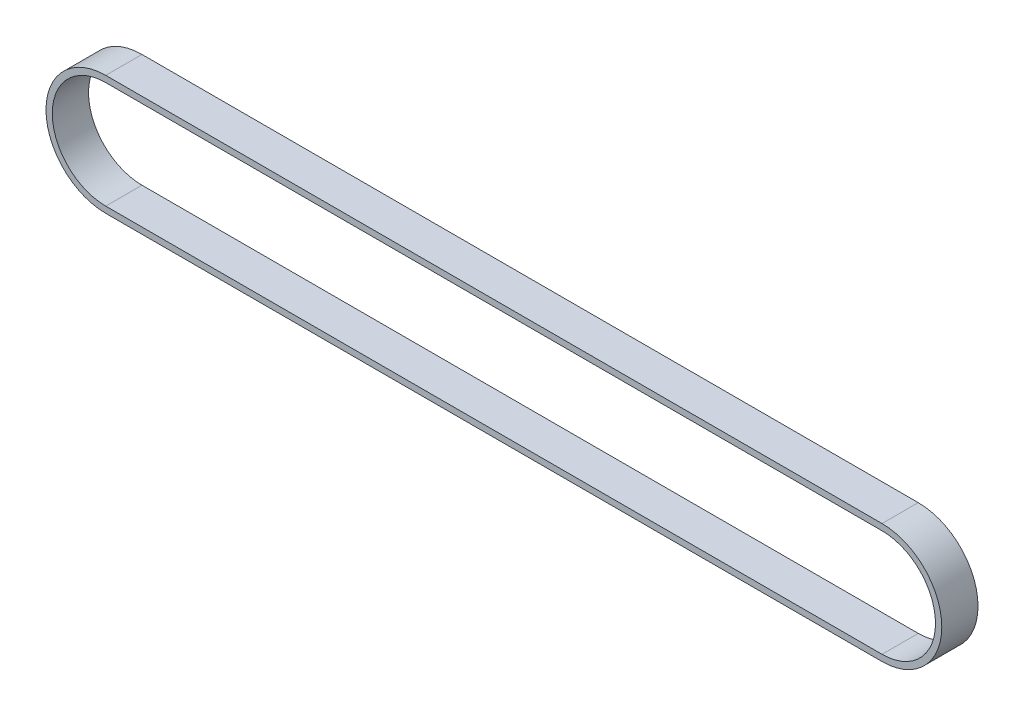
ISO-10303-21;
HEADER;
FILE_DESCRIPTION(('STEP AP214'),'2;1');
FILE_NAME('part.step','',(''),(''),'','','');
FILE_SCHEMA(('AUTOMOTIVE_DESIGN { 1 0 10303 214 1 1 1 1 }'));
ENDSEC;
DATA;
#1=APPLICATION_CONTEXT('core data for automotive mechanical design processes');
#2=APPLICATION_PROTOCOL_DEFINITION('international standard','automotive_design',2000,#1);
#3=PRODUCT_CONTEXT('',#1,'mechanical');
#4=PRODUCT('Part','Part','',(#3));
#5=PRODUCT_RELATED_PRODUCT_CATEGORY('part','',(#4));
#6=PRODUCT_DEFINITION_FORMATION('','',#4);
#7=PRODUCT_DEFINITION_CONTEXT('part definition',#1,'design');
#8=PRODUCT_DEFINITION('design','',#6,#7);
#9=PRODUCT_DEFINITION_SHAPE('','',#8);
#10=(LENGTH_UNIT() NAMED_UNIT(*) SI_UNIT(.MILLI.,.METRE.));
#11=(NAMED_UNIT(*) PLANE_ANGLE_UNIT() SI_UNIT($,.RADIAN.));
#12=(NAMED_UNIT(*) SI_UNIT($,.STERADIAN.) SOLID_ANGLE_UNIT());
#13=UNCERTAINTY_MEASURE_WITH_UNIT(LENGTH_MEASURE(1.E-05),#10,'distance_accuracy_value','');
#14=(GEOMETRIC_REPRESENTATION_CONTEXT(3) GLOBAL_UNCERTAINTY_ASSIGNED_CONTEXT((#13)) GLOBAL_UNIT_ASSIGNED_CONTEXT((#10,
#11,#12)) REPRESENTATION_CONTEXT('',''));
#15=CARTESIAN_POINT('',(0.,0.,0.));
#16=DIRECTION('',(0.,0.,1.));
#17=DIRECTION('',(1.,0.,0.));
#18=AXIS2_PLACEMENT_3D('',#15,#16,#17);
#19=CARTESIAN_POINT('',(137.17,0.,6.4));
#20=DIRECTION('',(0.,0.,-1.));
#21=DIRECTION('',(-1.,0.,0.));
#22=AXIS2_PLACEMENT_3D('',#19,#20,#21);
#23=CYLINDRICAL_SURFACE('',#22,10.56);
#24=CARTESIAN_POINT('',(137.17,0.,0.));
#25=DIRECTION('',(0.,0.,1.));
#26=DIRECTION('',(1.,0.,0.));
#27=AXIS2_PLACEMENT_3D('',#24,#25,#26);
#28=CIRCLE('',#27,10.56);
#29=CARTESIAN_POINT('',(137.17,-10.56,0.));
#30=VERTEX_POINT('',#29);
#31=CARTESIAN_POINT('',(137.17,10.56,0.));
#32=VERTEX_POINT('',#31);
#33=EDGE_CURVE('E137',#30,#32,#28,.T.);
#34=ORIENTED_EDGE('',*,*,#33,.T.);
#35=DIRECTION('',(0.,0.,-1.));
#36=VECTOR('',#35,1.);
#37=CARTESIAN_POINT('',(137.17,10.56,6.4));
#38=LINE('',#37,#36);
#39=CARTESIAN_POINT('',(137.17,10.56,6.4));
#40=VERTEX_POINT('',#39);
#41=EDGE_CURVE('E11',#40,#32,#38,.T.);
#42=ORIENTED_EDGE('',*,*,#41,.F.);
#43=CARTESIAN_POINT('',(137.17,0.,6.4));
#44=DIRECTION('',(0.,0.,1.));
#45=DIRECTION('',(1.,0.,0.));
#46=AXIS2_PLACEMENT_3D('',#43,#44,#45);
#47=CIRCLE('',#46,10.56);
#48=CARTESIAN_POINT('',(137.17,-10.56,6.4));
#49=VERTEX_POINT('',#48);
#50=EDGE_CURVE('E141',#49,#40,#47,.T.);
#51=ORIENTED_EDGE('',*,*,#50,.F.);
#52=DIRECTION('',(0.,0.,-1.));
#53=VECTOR('',#52,1.);
#54=CARTESIAN_POINT('',(137.17,-10.56,6.4));
#55=LINE('',#54,#53);
#56=EDGE_CURVE('E151',#49,#30,#55,.T.);
#57=ORIENTED_EDGE('',*,*,#56,.T.);
#58=EDGE_LOOP('',(#34,#42,#51,#57));
#59=FACE_BOUND('',#58,.T.);
#60=ADVANCED_FACE('F40',(#59),#23,.T.);
#61=CARTESIAN_POINT('',(0.,10.56,6.4));
#62=DIRECTION('',(0.,-1.,0.));
#63=DIRECTION('',(0.,0.,-1.));
#64=AXIS2_PLACEMENT_3D('',#61,#62,#63);
#65=PLANE('',#64);
#66=DIRECTION('',(-1.,0.,0.));
#67=VECTOR('',#66,1.);
#68=CARTESIAN_POINT('',(0.,10.56,0.));
#69=LINE('',#68,#67);
#70=CARTESIAN_POINT('',(0.,10.56,0.));
#71=VERTEX_POINT('',#70);
#72=EDGE_CURVE('E154',#32,#71,#69,.T.);
#73=ORIENTED_EDGE('',*,*,#72,.T.);
#74=DIRECTION('',(0.,0.,-1.));
#75=VECTOR('',#74,1.);
#76=CARTESIAN_POINT('',(0.,10.56,6.4));
#77=LINE('',#76,#75);
#78=CARTESIAN_POINT('',(0.,10.56,6.4));
#79=VERTEX_POINT('',#78);
#80=EDGE_CURVE('E47',#79,#71,#77,.T.);
#81=ORIENTED_EDGE('',*,*,#80,.F.);
#82=DIRECTION('',(-1.,0.,0.));
#83=VECTOR('',#82,1.);
#84=CARTESIAN_POINT('',(0.,10.56,6.4));
#85=LINE('',#84,#83);
#86=EDGE_CURVE('E144',#40,#79,#85,.T.);
#87=ORIENTED_EDGE('',*,*,#86,.F.);
#88=ORIENTED_EDGE('',*,*,#41,.T.);
#89=EDGE_LOOP('',(#73,#81,#87,#88));
#90=FACE_BOUND('',#89,.T.);
#91=ADVANCED_FACE('F182',(#90),#65,.F.);
#92=CARTESIAN_POINT('',(0.,0.,6.4));
#93=DIRECTION('',(0.,0.,-1.));
#94=DIRECTION('',(-1.,0.,0.));
#95=AXIS2_PLACEMENT_3D('',#92,#93,#94);
#96=CYLINDRICAL_SURFACE('',#95,10.56);
#97=CARTESIAN_POINT('',(0.,0.,0.));
#98=DIRECTION('',(0.,0.,1.));
#99=DIRECTION('',(1.,0.,0.));
#100=AXIS2_PLACEMENT_3D('',#97,#98,#99);
#101=CIRCLE('',#100,10.56);
#102=CARTESIAN_POINT('',(0.,-10.56,0.));
#103=VERTEX_POINT('',#102);
#104=EDGE_CURVE('E156',#71,#103,#101,.T.);
#105=ORIENTED_EDGE('',*,*,#104,.T.);
#106=DIRECTION('',(0.,0.,-1.));
#107=VECTOR('',#106,1.);
#108=CARTESIAN_POINT('',(0.,-10.56,6.4));
#109=LINE('',#108,#107);
#110=CARTESIAN_POINT('',(0.,-10.56,6.4));
#111=VERTEX_POINT('',#110);
#112=EDGE_CURVE('E161',#111,#103,#109,.T.);
#113=ORIENTED_EDGE('',*,*,#112,.F.);
#114=CARTESIAN_POINT('',(0.,0.,6.4));
#115=DIRECTION('',(0.,0.,1.));
#116=DIRECTION('',(1.,0.,0.));
#117=AXIS2_PLACEMENT_3D('',#114,#115,#116);
#118=CIRCLE('',#117,10.56);
#119=EDGE_CURVE('E147',#79,#111,#118,.T.);
#120=ORIENTED_EDGE('',*,*,#119,.F.);
#121=ORIENTED_EDGE('',*,*,#80,.T.);
#122=EDGE_LOOP('',(#105,#113,#120,#121));
#123=FACE_BOUND('',#122,.T.);
#124=ADVANCED_FACE('F168',(#123),#96,.T.);
#125=CARTESIAN_POINT('',(0.,-10.56,6.4));
#126=DIRECTION('',(0.,1.,0.));
#127=DIRECTION('',(0.,0.,1.));
#128=AXIS2_PLACEMENT_3D('',#125,#126,#127);
#129=PLANE('',#128);
#130=DIRECTION('',(1.,0.,0.));
#131=VECTOR('',#130,1.);
#132=CARTESIAN_POINT('',(0.,-10.56,0.));
#133=LINE('',#132,#131);
#134=EDGE_CURVE('E145',#103,#30,#133,.T.);
#135=ORIENTED_EDGE('',*,*,#134,.T.);
#136=ORIENTED_EDGE('',*,*,#56,.F.);
#137=DIRECTION('',(1.,0.,0.));
#138=VECTOR('',#137,1.);
#139=CARTESIAN_POINT('',(0.,-10.56,6.4));
#140=LINE('',#139,#138);
#141=EDGE_CURVE('E149',#111,#49,#140,.T.);
#142=ORIENTED_EDGE('',*,*,#141,.F.);
#143=ORIENTED_EDGE('',*,*,#112,.T.);
#144=EDGE_LOOP('',(#135,#136,#142,#143));
#145=FACE_BOUND('',#144,.T.);
#146=ADVANCED_FACE('F175',(#145),#129,.F.);
#147=CARTESIAN_POINT('',(137.17,0.,6.4));
#148=DIRECTION('',(0.,0.,1.));
#149=DIRECTION('',(1.,0.,0.));
#150=AXIS2_PLACEMENT_3D('',#147,#148,#149);
#151=PLANE('',#150);
#152=CARTESIAN_POINT('',(137.17,0.,6.4));
#153=DIRECTION('',(0.,0.,1.));
#154=DIRECTION('',(1.,0.,0.));
#155=AXIS2_PLACEMENT_3D('',#152,#153,#154);
#156=CIRCLE('',#155,9.45);
#157=CARTESIAN_POINT('',(137.17,-9.45,6.4));
#158=VERTEX_POINT('',#157);
#159=CARTESIAN_POINT('',(137.17,9.45,6.4));
#160=VERTEX_POINT('',#159);
#161=EDGE_CURVE('E54',#158,#160,#156,.T.);
#162=ORIENTED_EDGE('',*,*,#161,.F.);
#163=DIRECTION('',(1.,0.,0.));
#164=VECTOR('',#163,1.);
#165=CARTESIAN_POINT('',(0.,-9.45,6.4));
#166=LINE('',#165,#164);
#167=CARTESIAN_POINT('',(0.,-9.45,6.4));
#168=VERTEX_POINT('',#167);
#169=EDGE_CURVE('E122',#168,#158,#166,.T.);
#170=ORIENTED_EDGE('',*,*,#169,.F.);
#171=CARTESIAN_POINT('',(0.,0.,6.4));
#172=DIRECTION('',(0.,0.,1.));
#173=DIRECTION('',(1.,0.,0.));
#174=AXIS2_PLACEMENT_3D('',#171,#172,#173);
#175=CIRCLE('',#174,9.45);
#176=CARTESIAN_POINT('',(0.,9.45,6.4));
#177=VERTEX_POINT('',#176);
#178=EDGE_CURVE('E125',#177,#168,#175,.T.);
#179=ORIENTED_EDGE('',*,*,#178,.F.);
#180=DIRECTION('',(-1.,0.,0.));
#181=VECTOR('',#180,1.);
#182=CARTESIAN_POINT('',(0.,9.45,6.4));
#183=LINE('',#182,#181);
#184=EDGE_CURVE('E131',#160,#177,#183,.T.);
#185=ORIENTED_EDGE('',*,*,#184,.F.);
#186=EDGE_LOOP('',(#162,#170,#179,#185));
#187=FACE_BOUND('',#186,.T.);
#188=ORIENTED_EDGE('',*,*,#50,.T.);
#189=ORIENTED_EDGE('',*,*,#86,.T.);
#190=ORIENTED_EDGE('',*,*,#119,.T.);
#191=ORIENTED_EDGE('',*,*,#141,.T.);
#192=EDGE_LOOP('',(#188,#189,#190,#191));
#193=FACE_BOUND('',#192,.T.);
#194=ADVANCED_FACE('F181',(#187,#193),#151,.T.);
#195=CARTESIAN_POINT('',(137.17,0.,0.));
#196=DIRECTION('',(0.,0.,1.));
#197=DIRECTION('',(1.,0.,0.));
#198=AXIS2_PLACEMENT_3D('',#195,#196,#197);
#199=PLANE('',#198);
#200=DIRECTION('',(1.,0.,0.));
#201=VECTOR('',#200,1.);
#202=CARTESIAN_POINT('',(0.,-9.45,0.));
#203=LINE('',#202,#201);
#204=CARTESIAN_POINT('',(0.,-9.45,0.));
#205=VERTEX_POINT('',#204);
#206=CARTESIAN_POINT('',(137.17,-9.45,0.));
#207=VERTEX_POINT('',#206);
#208=EDGE_CURVE('E112',#205,#207,#203,.T.);
#209=ORIENTED_EDGE('',*,*,#208,.T.);
#210=CARTESIAN_POINT('',(137.17,0.,0.));
#211=DIRECTION('',(0.,0.,1.));
#212=DIRECTION('',(1.,0.,0.));
#213=AXIS2_PLACEMENT_3D('',#210,#211,#212);
#214=CIRCLE('',#213,9.45);
#215=CARTESIAN_POINT('',(137.17,9.45,0.));
#216=VERTEX_POINT('',#215);
#217=EDGE_CURVE('E106',#207,#216,#214,.T.);
#218=ORIENTED_EDGE('',*,*,#217,.T.);
#219=DIRECTION('',(-1.,0.,0.));
#220=VECTOR('',#219,1.);
#221=CARTESIAN_POINT('',(0.,9.45,0.));
#222=LINE('',#221,#220);
#223=CARTESIAN_POINT('',(0.,9.45,0.));
#224=VERTEX_POINT('',#223);
#225=EDGE_CURVE('E115',#216,#224,#222,.T.);
#226=ORIENTED_EDGE('',*,*,#225,.T.);
#227=CARTESIAN_POINT('',(0.,0.,0.));
#228=DIRECTION('',(0.,0.,1.));
#229=DIRECTION('',(1.,0.,0.));
#230=AXIS2_PLACEMENT_3D('',#227,#228,#229);
#231=CIRCLE('',#230,9.45);
#232=EDGE_CURVE('E62',#224,#205,#231,.T.);
#233=ORIENTED_EDGE('',*,*,#232,.T.);
#234=EDGE_LOOP('',(#209,#218,#226,#233));
#235=FACE_BOUND('',#234,.T.);
#236=ORIENTED_EDGE('',*,*,#33,.F.);
#237=ORIENTED_EDGE('',*,*,#134,.F.);
#238=ORIENTED_EDGE('',*,*,#104,.F.);
#239=ORIENTED_EDGE('',*,*,#72,.F.);
#240=EDGE_LOOP('',(#236,#237,#238,#239));
#241=FACE_BOUND('',#240,.T.);
#242=ADVANCED_FACE('F119',(#235,#241),#199,.F.);
#243=CARTESIAN_POINT('',(137.17,0.,0.));
#244=DIRECTION('',(0.,0.,1.));
#245=DIRECTION('',(1.,0.,0.));
#246=AXIS2_PLACEMENT_3D('',#243,#244,#245);
#247=CYLINDRICAL_SURFACE('',#246,9.45);
#248=ORIENTED_EDGE('',*,*,#161,.T.);
#249=DIRECTION('',(0.,0.,1.));
#250=VECTOR('',#249,1.);
#251=CARTESIAN_POINT('',(137.17,9.45,0.));
#252=LINE('',#251,#250);
#253=EDGE_CURVE('E102',#216,#160,#252,.T.);
#254=ORIENTED_EDGE('',*,*,#253,.F.);
#255=ORIENTED_EDGE('',*,*,#217,.F.);
#256=DIRECTION('',(0.,0.,1.));
#257=VECTOR('',#256,1.);
#258=CARTESIAN_POINT('',(137.17,-9.45,0.));
#259=LINE('',#258,#257);
#260=EDGE_CURVE('E135',#207,#158,#259,.T.);
#261=ORIENTED_EDGE('',*,*,#260,.T.);
#262=EDGE_LOOP('',(#248,#254,#255,#261));
#263=FACE_BOUND('',#262,.T.);
#264=ADVANCED_FACE('F104',(#263),#247,.F.);
#265=CARTESIAN_POINT('',(0.,-9.45,0.));
#266=DIRECTION('',(0.,-1.,0.));
#267=DIRECTION('',(0.,0.,-1.));
#268=AXIS2_PLACEMENT_3D('',#265,#266,#267);
#269=PLANE('',#268);
#270=ORIENTED_EDGE('',*,*,#169,.T.);
#271=ORIENTED_EDGE('',*,*,#260,.F.);
#272=ORIENTED_EDGE('',*,*,#208,.F.);
#273=DIRECTION('',(0.,0.,1.));
#274=VECTOR('',#273,1.);
#275=CARTESIAN_POINT('',(0.,-9.45,0.));
#276=LINE('',#275,#274);
#277=EDGE_CURVE('E138',#205,#168,#276,.T.);
#278=ORIENTED_EDGE('',*,*,#277,.T.);
#279=EDGE_LOOP('',(#270,#271,#272,#278));
#280=FACE_BOUND('',#279,.T.);
#281=ADVANCED_FACE('F199',(#280),#269,.F.);
#282=CARTESIAN_POINT('',(0.,0.,0.));
#283=DIRECTION('',(0.,0.,1.));
#284=DIRECTION('',(1.,0.,0.));
#285=AXIS2_PLACEMENT_3D('',#282,#283,#284);
#286=CYLINDRICAL_SURFACE('',#285,9.45);
#287=ORIENTED_EDGE('',*,*,#178,.T.);
#288=ORIENTED_EDGE('',*,*,#277,.F.);
#289=ORIENTED_EDGE('',*,*,#232,.F.);
#290=DIRECTION('',(0.,0.,1.));
#291=VECTOR('',#290,1.);
#292=CARTESIAN_POINT('',(0.,9.45,0.));
#293=LINE('',#292,#291);
#294=EDGE_CURVE('E111',#224,#177,#293,.T.);
#295=ORIENTED_EDGE('',*,*,#294,.T.);
#296=EDGE_LOOP('',(#287,#288,#289,#295));
#297=FACE_BOUND('',#296,.T.);
#298=ADVANCED_FACE('F202',(#297),#286,.F.);
#299=CARTESIAN_POINT('',(0.,9.45,0.));
#300=DIRECTION('',(0.,1.,0.));
#301=DIRECTION('',(0.,0.,1.));
#302=AXIS2_PLACEMENT_3D('',#299,#300,#301);
#303=PLANE('',#302);
#304=ORIENTED_EDGE('',*,*,#184,.T.);
#305=ORIENTED_EDGE('',*,*,#294,.F.);
#306=ORIENTED_EDGE('',*,*,#225,.F.);
#307=ORIENTED_EDGE('',*,*,#253,.T.);
#308=EDGE_LOOP('',(#304,#305,#306,#307));
#309=FACE_BOUND('',#308,.T.);
#310=ADVANCED_FACE('F116',(#309),#303,.F.);
#311=CLOSED_SHELL('',(#60,#91,#124,#146,#194,#242,#264,#281,#298,#310));
#312=MANIFOLD_SOLID_BREP('B2',#311);
#313=ADVANCED_BREP_SHAPE_REPRESENTATION('',(#18,#312),#14);
#314=SHAPE_DEFINITION_REPRESENTATION(#9,#313);
ENDSEC;
END-ISO-10303-21;
